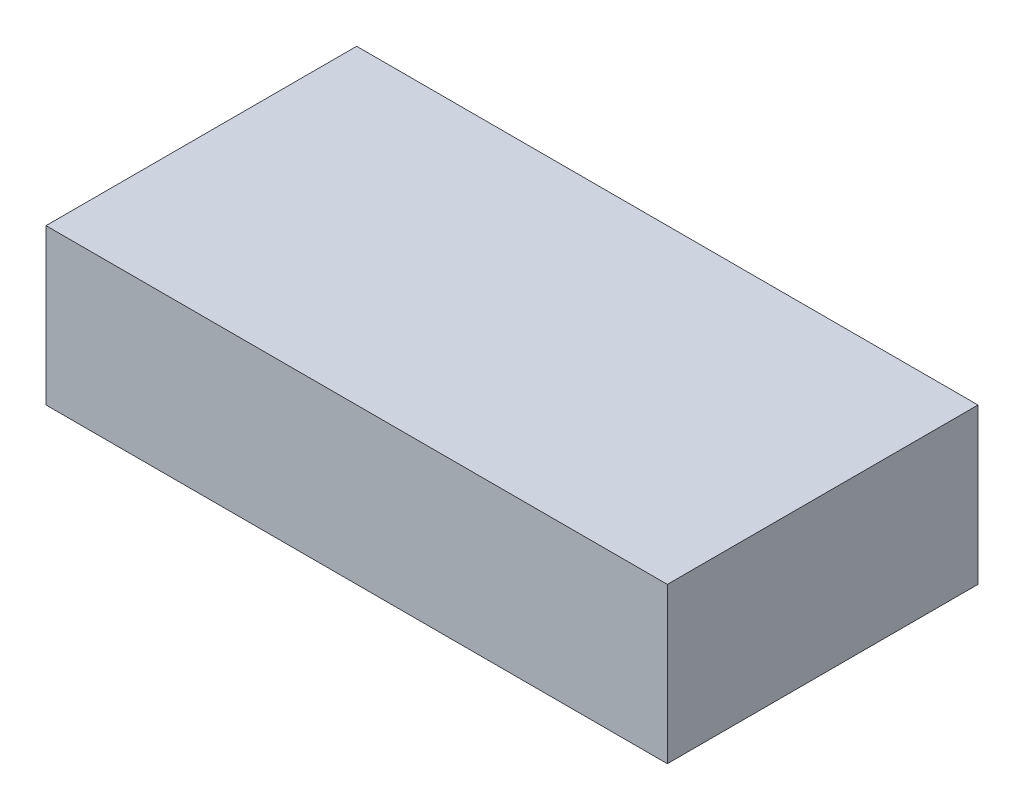
ISO-10303-21;
HEADER;
FILE_DESCRIPTION(('STEP AP214'),'2;1');
FILE_NAME('part.step','',(''),(''),'','','');
FILE_SCHEMA(('AUTOMOTIVE_DESIGN { 1 0 10303 214 1 1 1 1 }'));
ENDSEC;
DATA;
#1=APPLICATION_CONTEXT('core data for automotive mechanical design processes');
#2=APPLICATION_PROTOCOL_DEFINITION('international standard','automotive_design',2000,#1);
#3=PRODUCT_CONTEXT('',#1,'mechanical');
#4=PRODUCT('Part','Part','',(#3));
#5=PRODUCT_RELATED_PRODUCT_CATEGORY('part','',(#4));
#6=PRODUCT_DEFINITION_FORMATION('','',#4);
#7=PRODUCT_DEFINITION_CONTEXT('part definition',#1,'design');
#8=PRODUCT_DEFINITION('design','',#6,#7);
#9=PRODUCT_DEFINITION_SHAPE('','',#8);
#10=(LENGTH_UNIT() NAMED_UNIT(*) SI_UNIT(.MILLI.,.METRE.));
#11=(NAMED_UNIT(*) PLANE_ANGLE_UNIT() SI_UNIT($,.RADIAN.));
#12=(NAMED_UNIT(*) SI_UNIT($,.STERADIAN.) SOLID_ANGLE_UNIT());
#13=UNCERTAINTY_MEASURE_WITH_UNIT(LENGTH_MEASURE(1.E-05),#10,'distance_accuracy_value','');
#14=(GEOMETRIC_REPRESENTATION_CONTEXT(3) GLOBAL_UNCERTAINTY_ASSIGNED_CONTEXT((#13)) GLOBAL_UNIT_ASSIGNED_CONTEXT((#10,
#11,#12)) REPRESENTATION_CONTEXT('',''));
#15=CARTESIAN_POINT('',(0.,0.,0.));
#16=DIRECTION('',(0.,0.,1.));
#17=DIRECTION('',(1.,0.,0.));
#18=AXIS2_PLACEMENT_3D('',#15,#16,#17);
#19=CARTESIAN_POINT('',(0.,10.,0.));
#20=DIRECTION('',(1.,0.,0.));
#21=DIRECTION('',(0.,0.,-1.));
#22=AXIS2_PLACEMENT_3D('',#19,#20,#21);
#23=PLANE('',#22);
#24=DIRECTION('',(0.,0.,1.));
#25=VECTOR('',#24,1.);
#26=CARTESIAN_POINT('',(0.,0.,0.));
#27=LINE('',#26,#25);
#28=CARTESIAN_POINT('',(0.,0.,-20.));
#29=VERTEX_POINT('',#28);
#30=CARTESIAN_POINT('',(0.,0.,0.));
#31=VERTEX_POINT('',#30);
#32=EDGE_CURVE('E106',#29,#31,#27,.T.);
#33=ORIENTED_EDGE('',*,*,#32,.T.);
#34=DIRECTION('',(0.,-1.,0.));
#35=VECTOR('',#34,1.);
#36=CARTESIAN_POINT('',(0.,10.,0.));
#37=LINE('',#36,#35);
#38=CARTESIAN_POINT('',(0.,10.,0.));
#39=VERTEX_POINT('',#38);
#40=EDGE_CURVE('E11',#39,#31,#37,.T.);
#41=ORIENTED_EDGE('',*,*,#40,.F.);
#42=DIRECTION('',(0.,0.,1.));
#43=VECTOR('',#42,1.);
#44=CARTESIAN_POINT('',(0.,10.,0.));
#45=LINE('',#44,#43);
#46=CARTESIAN_POINT('',(0.,10.,-20.));
#47=VERTEX_POINT('',#46);
#48=EDGE_CURVE('E92',#47,#39,#45,.T.);
#49=ORIENTED_EDGE('',*,*,#48,.F.);
#50=DIRECTION('',(0.,-1.,0.));
#51=VECTOR('',#50,1.);
#52=CARTESIAN_POINT('',(0.,10.,-20.));
#53=LINE('',#52,#51);
#54=EDGE_CURVE('E105',#47,#29,#53,.T.);
#55=ORIENTED_EDGE('',*,*,#54,.T.);
#56=EDGE_LOOP('',(#33,#41,#49,#55));
#57=FACE_BOUND('',#56,.T.);
#58=ADVANCED_FACE('F43',(#57),#23,.F.);
#59=CARTESIAN_POINT('',(0.,10.,0.));
#60=DIRECTION('',(0.,0.,-1.));
#61=DIRECTION('',(-1.,0.,0.));
#62=AXIS2_PLACEMENT_3D('',#59,#60,#61);
#63=PLANE('',#62);
#64=DIRECTION('',(1.,0.,0.));
#65=VECTOR('',#64,1.);
#66=CARTESIAN_POINT('',(0.,0.,0.));
#67=LINE('',#66,#65);
#68=CARTESIAN_POINT('',(40.,0.,0.));
#69=VERTEX_POINT('',#68);
#70=EDGE_CURVE('E97',#31,#69,#67,.T.);
#71=ORIENTED_EDGE('',*,*,#70,.T.);
#72=DIRECTION('',(0.,-1.,0.));
#73=VECTOR('',#72,1.);
#74=CARTESIAN_POINT('',(40.,10.,0.));
#75=LINE('',#74,#73);
#76=CARTESIAN_POINT('',(40.,10.,0.));
#77=VERTEX_POINT('',#76);
#78=EDGE_CURVE('E51',#77,#69,#75,.T.);
#79=ORIENTED_EDGE('',*,*,#78,.F.);
#80=DIRECTION('',(1.,0.,0.));
#81=VECTOR('',#80,1.);
#82=CARTESIAN_POINT('',(0.,10.,0.));
#83=LINE('',#82,#81);
#84=EDGE_CURVE('E87',#39,#77,#83,.T.);
#85=ORIENTED_EDGE('',*,*,#84,.F.);
#86=ORIENTED_EDGE('',*,*,#40,.T.);
#87=EDGE_LOOP('',(#71,#79,#85,#86));
#88=FACE_BOUND('',#87,.T.);
#89=ADVANCED_FACE('F100',(#88),#63,.F.);
#90=CARTESIAN_POINT('',(40.,10.,0.));
#91=DIRECTION('',(-1.,0.,0.));
#92=DIRECTION('',(0.,0.,1.));
#93=AXIS2_PLACEMENT_3D('',#90,#91,#92);
#94=PLANE('',#93);
#95=DIRECTION('',(0.,0.,-1.));
#96=VECTOR('',#95,1.);
#97=CARTESIAN_POINT('',(40.,0.,0.));
#98=LINE('',#97,#96);
#99=CARTESIAN_POINT('',(40.,0.,-20.));
#100=VERTEX_POINT('',#99);
#101=EDGE_CURVE('E78',#69,#100,#98,.T.);
#102=ORIENTED_EDGE('',*,*,#101,.T.);
#103=DIRECTION('',(0.,-1.,0.));
#104=VECTOR('',#103,1.);
#105=CARTESIAN_POINT('',(40.,10.,-20.));
#106=LINE('',#105,#104);
#107=CARTESIAN_POINT('',(40.,10.,-20.));
#108=VERTEX_POINT('',#107);
#109=EDGE_CURVE('E98',#108,#100,#106,.T.);
#110=ORIENTED_EDGE('',*,*,#109,.F.);
#111=DIRECTION('',(0.,0.,-1.));
#112=VECTOR('',#111,1.);
#113=CARTESIAN_POINT('',(40.,10.,0.));
#114=LINE('',#113,#112);
#115=EDGE_CURVE('E95',#77,#108,#114,.T.);
#116=ORIENTED_EDGE('',*,*,#115,.F.);
#117=ORIENTED_EDGE('',*,*,#78,.T.);
#118=EDGE_LOOP('',(#102,#110,#116,#117));
#119=FACE_BOUND('',#118,.T.);
#120=ADVANCED_FACE('F99',(#119),#94,.F.);
#121=CARTESIAN_POINT('',(0.,10.,-20.));
#122=DIRECTION('',(0.,0.,1.));
#123=DIRECTION('',(1.,0.,0.));
#124=AXIS2_PLACEMENT_3D('',#121,#122,#123);
#125=PLANE('',#124);
#126=DIRECTION('',(-1.,0.,0.));
#127=VECTOR('',#126,1.);
#128=CARTESIAN_POINT('',(0.,0.,-20.));
#129=LINE('',#128,#127);
#130=EDGE_CURVE('E85',#100,#29,#129,.T.);
#131=ORIENTED_EDGE('',*,*,#130,.T.);
#132=ORIENTED_EDGE('',*,*,#54,.F.);
#133=DIRECTION('',(-1.,0.,0.));
#134=VECTOR('',#133,1.);
#135=CARTESIAN_POINT('',(0.,10.,-20.));
#136=LINE('',#135,#134);
#137=EDGE_CURVE('E56',#108,#47,#136,.T.);
#138=ORIENTED_EDGE('',*,*,#137,.F.);
#139=ORIENTED_EDGE('',*,*,#109,.T.);
#140=EDGE_LOOP('',(#131,#132,#138,#139));
#141=FACE_BOUND('',#140,.T.);
#142=ADVANCED_FACE('F111',(#141),#125,.F.);
#143=CARTESIAN_POINT('',(0.,10.,0.));
#144=DIRECTION('',(0.,-1.,0.));
#145=DIRECTION('',(0.,0.,-1.));
#146=AXIS2_PLACEMENT_3D('',#143,#144,#145);
#147=PLANE('',#146);
#148=ORIENTED_EDGE('',*,*,#48,.T.);
#149=ORIENTED_EDGE('',*,*,#84,.T.);
#150=ORIENTED_EDGE('',*,*,#115,.T.);
#151=ORIENTED_EDGE('',*,*,#137,.T.);
#152=EDGE_LOOP('',(#148,#149,#150,#151));
#153=FACE_BOUND('',#152,.T.);
#154=ADVANCED_FACE('F89',(#153),#147,.F.);
#155=CARTESIAN_POINT('',(0.,0.,0.));
#156=DIRECTION('',(0.,-1.,0.));
#157=DIRECTION('',(0.,0.,-1.));
#158=AXIS2_PLACEMENT_3D('',#155,#156,#157);
#159=PLANE('',#158);
#160=ORIENTED_EDGE('',*,*,#32,.F.);
#161=ORIENTED_EDGE('',*,*,#130,.F.);
#162=ORIENTED_EDGE('',*,*,#101,.F.);
#163=ORIENTED_EDGE('',*,*,#70,.F.);
#164=EDGE_LOOP('',(#160,#161,#162,#163));
#165=FACE_BOUND('',#164,.T.);
#166=ADVANCED_FACE('F116',(#165),#159,.T.);
#167=CLOSED_SHELL('',(#58,#89,#120,#142,#154,#166));
#168=MANIFOLD_SOLID_BREP('B2',#167);
#169=ADVANCED_BREP_SHAPE_REPRESENTATION('',(#18,#168),#14);
#170=SHAPE_DEFINITION_REPRESENTATION(#9,#169);
ENDSEC;
END-ISO-10303-21;
